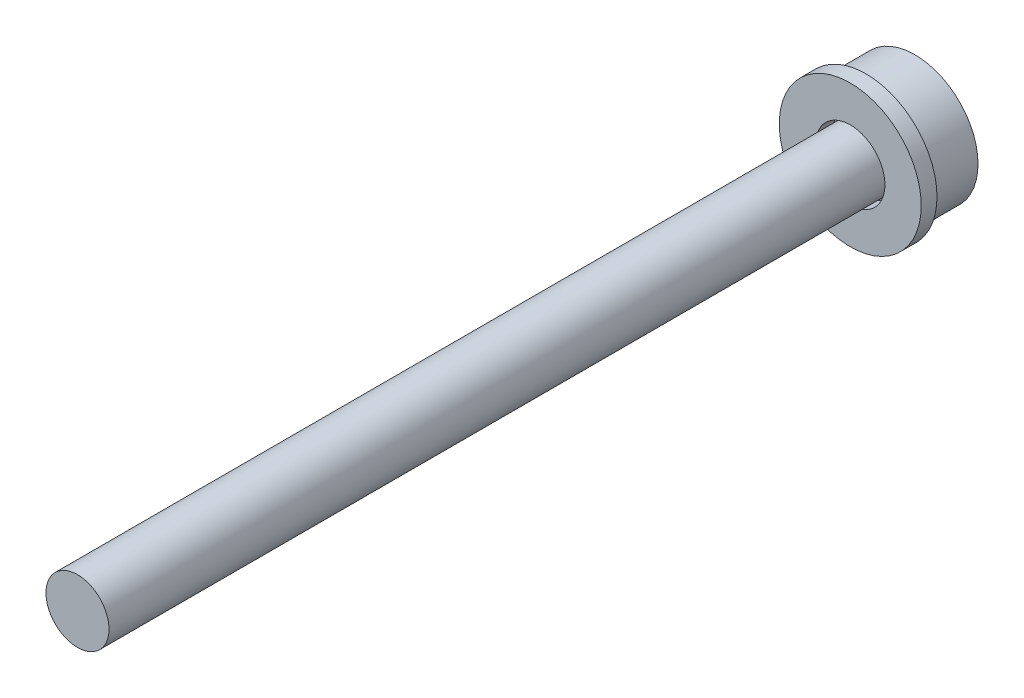
ISO-10303-21;
HEADER;
FILE_DESCRIPTION(('STEP AP214'),'2;1');
FILE_NAME('part.step','',(''),(''),'','','');
FILE_SCHEMA(('AUTOMOTIVE_DESIGN { 1 0 10303 214 1 1 1 1 }'));
ENDSEC;
DATA;
#1=APPLICATION_CONTEXT('core data for automotive mechanical design processes');
#2=APPLICATION_PROTOCOL_DEFINITION('international standard','automotive_design',2000,#1);
#3=PRODUCT_CONTEXT('',#1,'mechanical');
#4=PRODUCT('Part','Part','',(#3));
#5=PRODUCT_RELATED_PRODUCT_CATEGORY('part','',(#4));
#6=PRODUCT_DEFINITION_FORMATION('','',#4);
#7=PRODUCT_DEFINITION_CONTEXT('part definition',#1,'design');
#8=PRODUCT_DEFINITION('design','',#6,#7);
#9=PRODUCT_DEFINITION_SHAPE('','',#8);
#10=(LENGTH_UNIT() NAMED_UNIT(*) SI_UNIT(.MILLI.,.METRE.));
#11=(NAMED_UNIT(*) PLANE_ANGLE_UNIT() SI_UNIT($,.RADIAN.));
#12=(NAMED_UNIT(*) SI_UNIT($,.STERADIAN.) SOLID_ANGLE_UNIT());
#13=UNCERTAINTY_MEASURE_WITH_UNIT(LENGTH_MEASURE(1.E-05),#10,'distance_accuracy_value','');
#14=(GEOMETRIC_REPRESENTATION_CONTEXT(3) GLOBAL_UNCERTAINTY_ASSIGNED_CONTEXT((#13)) GLOBAL_UNIT_ASSIGNED_CONTEXT((#10,
#11,#12)) REPRESENTATION_CONTEXT('',''));
#15=CARTESIAN_POINT('',(0.,0.,0.));
#16=DIRECTION('',(0.,0.,1.));
#17=DIRECTION('',(1.,0.,0.));
#18=AXIS2_PLACEMENT_3D('',#15,#16,#17);
#19=CARTESIAN_POINT('',(0.,0.,53.2));
#20=DIRECTION('',(0.,0.,1.));
#21=DIRECTION('',(1.,0.,0.));
#22=AXIS2_PLACEMENT_3D('',#19,#20,#21);
#23=PLANE('',#22);
#24=CARTESIAN_POINT('',(0.,0.,53.2));
#25=DIRECTION('',(0.,0.,1.));
#26=DIRECTION('',(1.,0.,0.));
#27=AXIS2_PLACEMENT_3D('',#24,#25,#26);
#28=CIRCLE('',#27,2.);
#29=CARTESIAN_POINT('',(2.,0.,53.2));
#30=VERTEX_POINT('',#29);
#31=EDGE_CURVE('E8',#30,#30,#28,.T.);
#32=ORIENTED_EDGE('',*,*,#31,.T.);
#33=EDGE_LOOP('',(#32));
#34=FACE_BOUND('',#33,.T.);
#35=ADVANCED_FACE('F13',(#34),#23,.T.);
#36=CARTESIAN_POINT('',(0.,0.,3.2));
#37=DIRECTION('',(0.,0.,1.));
#38=DIRECTION('',(1.,0.,0.));
#39=AXIS2_PLACEMENT_3D('',#36,#37,#38);
#40=CYLINDRICAL_SURFACE('',#39,2.);
#41=ORIENTED_EDGE('',*,*,#31,.F.);
#42=EDGE_LOOP('',(#41));
#43=FACE_BOUND('',#42,.T.);
#44=CARTESIAN_POINT('',(0.,0.,3.2));
#45=DIRECTION('',(0.,0.,1.));
#46=DIRECTION('',(1.,0.,0.));
#47=AXIS2_PLACEMENT_3D('',#44,#45,#46);
#48=CIRCLE('',#47,2.);
#49=CARTESIAN_POINT('',(2.,0.,3.2));
#50=VERTEX_POINT('',#49);
#51=EDGE_CURVE('E21',#50,#50,#48,.T.);
#52=ORIENTED_EDGE('',*,*,#51,.T.);
#53=EDGE_LOOP('',(#52));
#54=FACE_BOUND('',#53,.T.);
#55=ADVANCED_FACE('F15',(#43,#54),#40,.T.);
#56=CARTESIAN_POINT('',(0.,0.,0.1));
#57=DIRECTION('',(0.,0.,1.));
#58=DIRECTION('',(1.,0.,0.));
#59=AXIS2_PLACEMENT_3D('',#56,#57,#58);
#60=PLANE('',#59);
#61=CARTESIAN_POINT('',(0.,0.,0.1));
#62=DIRECTION('',(0.,0.,1.));
#63=DIRECTION('',(1.,0.,0.));
#64=AXIS2_PLACEMENT_3D('',#61,#62,#63);
#65=CIRCLE('',#64,4.);
#66=CARTESIAN_POINT('',(4.,0.,0.1));
#67=VERTEX_POINT('',#66);
#68=EDGE_CURVE('E30',#67,#67,#65,.T.);
#69=ORIENTED_EDGE('',*,*,#68,.F.);
#70=EDGE_LOOP('',(#69));
#71=FACE_BOUND('',#70,.T.);
#72=ADVANCED_FACE('F94',(#71),#60,.F.);
#73=CARTESIAN_POINT('',(0.,0.,3.2));
#74=DIRECTION('',(0.,0.,1.));
#75=DIRECTION('',(1.,0.,0.));
#76=AXIS2_PLACEMENT_3D('',#73,#74,#75);
#77=PLANE('',#76);
#78=ORIENTED_EDGE('',*,*,#51,.F.);
#79=EDGE_LOOP('',(#78));
#80=FACE_BOUND('',#79,.T.);
#81=CARTESIAN_POINT('',(0.,0.,3.2));
#82=DIRECTION('',(0.,0.,1.));
#83=DIRECTION('',(1.,0.,0.));
#84=AXIS2_PLACEMENT_3D('',#81,#82,#83);
#85=CIRCLE('',#84,2.2);
#86=CARTESIAN_POINT('',(2.2,0.,3.2));
#87=VERTEX_POINT('',#86);
#88=EDGE_CURVE('E38',#87,#87,#85,.T.);
#89=ORIENTED_EDGE('',*,*,#88,.T.);
#90=EDGE_LOOP('',(#89));
#91=FACE_BOUND('',#90,.T.);
#92=ADVANCED_FACE('F98',(#80,#91),#77,.T.);
#93=CARTESIAN_POINT('',(0.,0.,0.1));
#94=DIRECTION('',(0.,0.,1.));
#95=DIRECTION('',(1.,0.,0.));
#96=AXIS2_PLACEMENT_3D('',#93,#94,#95);
#97=CYLINDRICAL_SURFACE('',#96,4.);
#98=CARTESIAN_POINT('',(0.,0.,3.2));
#99=DIRECTION('',(0.,0.,1.));
#100=DIRECTION('',(1.,0.,0.));
#101=AXIS2_PLACEMENT_3D('',#98,#99,#100);
#102=CIRCLE('',#101,4.);
#103=CARTESIAN_POINT('',(4.,0.,3.2));
#104=VERTEX_POINT('',#103);
#105=EDGE_CURVE('E41',#104,#104,#102,.T.);
#106=ORIENTED_EDGE('',*,*,#105,.F.);
#107=EDGE_LOOP('',(#106));
#108=FACE_BOUND('',#107,.T.);
#109=ORIENTED_EDGE('',*,*,#68,.T.);
#110=EDGE_LOOP('',(#109));
#111=FACE_BOUND('',#110,.T.);
#112=ADVANCED_FACE('F87',(#108,#111),#97,.T.);
#113=CARTESIAN_POINT('',(0.,0.,3.1));
#114=DIRECTION('',(0.,0.,1.));
#115=DIRECTION('',(1.,0.,0.));
#116=AXIS2_PLACEMENT_3D('',#113,#114,#115);
#117=CYLINDRICAL_SURFACE('',#116,2.2);
#118=CARTESIAN_POINT('',(0.,0.,4.2));
#119=DIRECTION('',(0.,0.,1.));
#120=DIRECTION('',(1.,0.,0.));
#121=AXIS2_PLACEMENT_3D('',#118,#119,#120);
#122=CIRCLE('',#121,2.2);
#123=CARTESIAN_POINT('',(2.2,0.,4.2));
#124=VERTEX_POINT('',#123);
#125=EDGE_CURVE('E48',#124,#124,#122,.T.);
#126=ORIENTED_EDGE('',*,*,#125,.T.);
#127=EDGE_LOOP('',(#126));
#128=FACE_BOUND('',#127,.T.);
#129=ORIENTED_EDGE('',*,*,#88,.F.);
#130=EDGE_LOOP('',(#129));
#131=FACE_BOUND('',#130,.T.);
#132=ADVANCED_FACE('F78',(#128,#131),#117,.F.);
#133=CARTESIAN_POINT('',(0.,0.,3.2));
#134=DIRECTION('',(0.,0.,1.));
#135=DIRECTION('',(1.,0.,0.));
#136=AXIS2_PLACEMENT_3D('',#133,#134,#135);
#137=PLANE('',#136);
#138=ORIENTED_EDGE('',*,*,#105,.T.);
#139=EDGE_LOOP('',(#138));
#140=FACE_BOUND('',#139,.T.);
#141=CARTESIAN_POINT('',(0.,0.,3.2));
#142=DIRECTION('',(0.,0.,1.));
#143=DIRECTION('',(1.,0.,0.));
#144=AXIS2_PLACEMENT_3D('',#141,#142,#143);
#145=CIRCLE('',#144,4.5);
#146=CARTESIAN_POINT('',(4.5,0.,3.2));
#147=VERTEX_POINT('',#146);
#148=EDGE_CURVE('E54',#147,#147,#145,.T.);
#149=ORIENTED_EDGE('',*,*,#148,.F.);
#150=EDGE_LOOP('',(#149));
#151=FACE_BOUND('',#150,.T.);
#152=ADVANCED_FACE('F76',(#140,#151),#137,.F.);
#153=CARTESIAN_POINT('',(0.,0.,4.2));
#154=DIRECTION('',(0.,0.,1.));
#155=DIRECTION('',(1.,0.,0.));
#156=AXIS2_PLACEMENT_3D('',#153,#154,#155);
#157=PLANE('',#156);
#158=ORIENTED_EDGE('',*,*,#125,.F.);
#159=EDGE_LOOP('',(#158));
#160=FACE_BOUND('',#159,.T.);
#161=CARTESIAN_POINT('',(0.,0.,4.2));
#162=DIRECTION('',(0.,0.,1.));
#163=DIRECTION('',(1.,0.,0.));
#164=AXIS2_PLACEMENT_3D('',#161,#162,#163);
#165=CIRCLE('',#164,4.5);
#166=CARTESIAN_POINT('',(4.5,0.,4.2));
#167=VERTEX_POINT('',#166);
#168=EDGE_CURVE('E60',#167,#167,#165,.T.);
#169=ORIENTED_EDGE('',*,*,#168,.T.);
#170=EDGE_LOOP('',(#169));
#171=FACE_BOUND('',#170,.T.);
#172=ADVANCED_FACE('F68',(#160,#171),#157,.T.);
#173=CARTESIAN_POINT('',(0.,0.,3.2));
#174=DIRECTION('',(0.,0.,1.));
#175=DIRECTION('',(1.,0.,0.));
#176=AXIS2_PLACEMENT_3D('',#173,#174,#175);
#177=CYLINDRICAL_SURFACE('',#176,4.5);
#178=ORIENTED_EDGE('',*,*,#168,.F.);
#179=EDGE_LOOP('',(#178));
#180=FACE_BOUND('',#179,.T.);
#181=ORIENTED_EDGE('',*,*,#148,.T.);
#182=EDGE_LOOP('',(#181));
#183=FACE_BOUND('',#182,.T.);
#184=ADVANCED_FACE('F70',(#180,#183),#177,.T.);
#185=CLOSED_SHELL('',(#35,#55,#72,#92,#112,#132,#152,#172,#184));
#186=MANIFOLD_SOLID_BREP('B1',#185);
#187=ADVANCED_BREP_SHAPE_REPRESENTATION('',(#18,#186),#14);
#188=SHAPE_DEFINITION_REPRESENTATION(#9,#187);
ENDSEC;
END-ISO-10303-21;
